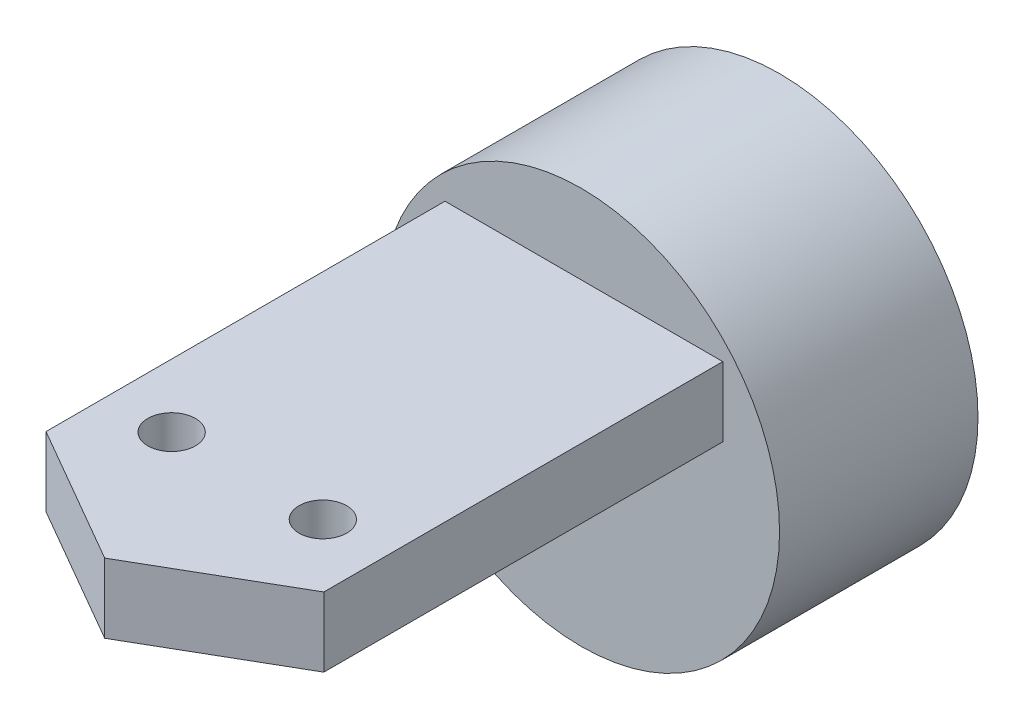
ISO-10303-21;
HEADER;
FILE_DESCRIPTION(('STEP AP214'),'2;1');
FILE_NAME('part.step','',(''),(''),'','','');
FILE_SCHEMA(('AUTOMOTIVE_DESIGN { 1 0 10303 214 1 1 1 1 }'));
ENDSEC;
DATA;
#1=APPLICATION_CONTEXT('core data for automotive mechanical design processes');
#2=APPLICATION_PROTOCOL_DEFINITION('international standard','automotive_design',2000,#1);
#3=PRODUCT_CONTEXT('',#1,'mechanical');
#4=PRODUCT('Part','Part','',(#3));
#5=PRODUCT_RELATED_PRODUCT_CATEGORY('part','',(#4));
#6=PRODUCT_DEFINITION_FORMATION('','',#4);
#7=PRODUCT_DEFINITION_CONTEXT('part definition',#1,'design');
#8=PRODUCT_DEFINITION('design','',#6,#7);
#9=PRODUCT_DEFINITION_SHAPE('','',#8);
#10=(LENGTH_UNIT() NAMED_UNIT(*) SI_UNIT(.MILLI.,.METRE.));
#11=(NAMED_UNIT(*) PLANE_ANGLE_UNIT() SI_UNIT($,.RADIAN.));
#12=(NAMED_UNIT(*) SI_UNIT($,.STERADIAN.) SOLID_ANGLE_UNIT());
#13=UNCERTAINTY_MEASURE_WITH_UNIT(LENGTH_MEASURE(1.E-05),#10,'distance_accuracy_value','');
#14=(GEOMETRIC_REPRESENTATION_CONTEXT(3) GLOBAL_UNCERTAINTY_ASSIGNED_CONTEXT((#13)) GLOBAL_UNIT_ASSIGNED_CONTEXT((#10,
#11,#12)) REPRESENTATION_CONTEXT('',''));
#15=CARTESIAN_POINT('',(0.,0.,0.));
#16=DIRECTION('',(0.,0.,1.));
#17=DIRECTION('',(1.,0.,0.));
#18=AXIS2_PLACEMENT_3D('',#15,#16,#17);
#19=CARTESIAN_POINT('',(0.,0.,10.));
#20=DIRECTION('',(0.,0.,1.));
#21=DIRECTION('',(1.,0.,0.));
#22=AXIS2_PLACEMENT_3D('',#19,#20,#21);
#23=PLANE('',#22);
#24=DIRECTION('',(0.,1.,0.));
#25=VECTOR('',#24,1.);
#26=CARTESIAN_POINT('',(7.1404429663646,-24.,10.));
#27=LINE('',#26,#25);
#28=CARTESIAN_POINT('',(7.1404429663646,2.5,10.));
#29=VERTEX_POINT('',#28);
#30=CARTESIAN_POINT('',(7.1404429663646,6.,10.));
#31=VERTEX_POINT('',#30);
#32=EDGE_CURVE('E99',#29,#31,#27,.T.);
#33=ORIENTED_EDGE('',*,*,#32,.F.);
#34=DIRECTION('',(1.,0.,0.));
#35=VECTOR('',#34,1.);
#36=CARTESIAN_POINT('',(0.,2.5,10.));
#37=LINE('',#36,#35);
#38=CARTESIAN_POINT('',(-6.85955703363552,2.5,10.));
#39=VERTEX_POINT('',#38);
#40=EDGE_CURVE('E129',#39,#29,#37,.T.);
#41=ORIENTED_EDGE('',*,*,#40,.F.);
#42=DIRECTION('',(0.,1.,0.));
#43=VECTOR('',#42,1.);
#44=CARTESIAN_POINT('',(-6.85955703363552,-24.,10.));
#45=LINE('',#44,#43);
#46=CARTESIAN_POINT('',(-6.85955703363552,6.,10.));
#47=VERTEX_POINT('',#46);
#48=EDGE_CURVE('E126',#39,#47,#45,.T.);
#49=ORIENTED_EDGE('',*,*,#48,.T.);
#50=DIRECTION('',(1.,0.,0.));
#51=VECTOR('',#50,1.);
#52=CARTESIAN_POINT('',(0.,6.,10.));
#53=LINE('',#52,#51);
#54=EDGE_CURVE('E119',#47,#31,#53,.T.);
#55=ORIENTED_EDGE('',*,*,#54,.T.);
#56=EDGE_LOOP('',(#33,#41,#49,#55));
#57=FACE_BOUND('',#56,.T.);
#58=CARTESIAN_POINT('',(0.,0.,10.));
#59=DIRECTION('',(0.,0.,1.));
#60=DIRECTION('',(1.,0.,0.));
#61=AXIS2_PLACEMENT_3D('',#58,#59,#60);
#62=CIRCLE('',#61,10.);
#63=CARTESIAN_POINT('',(10.,0.,10.));
#64=VERTEX_POINT('',#63);
#65=EDGE_CURVE('E163',#64,#64,#62,.T.);
#66=ORIENTED_EDGE('',*,*,#65,.T.);
#67=EDGE_LOOP('',(#66));
#68=FACE_BOUND('',#67,.T.);
#69=ADVANCED_FACE('F50',(#57,#68),#23,.T.);
#70=CARTESIAN_POINT('',(0.,2.5,40.));
#71=DIRECTION('',(0.,1.,0.));
#72=DIRECTION('',(0.,0.,1.));
#73=AXIS2_PLACEMENT_3D('',#70,#71,#72);
#74=PLANE('',#73);
#75=CARTESIAN_POINT('',(-3.66955703363546,2.5,26.9651136233699));
#76=DIRECTION('',(0.,1.,0.));
#77=DIRECTION('',(0.,0.,1.));
#78=AXIS2_PLACEMENT_3D('',#75,#76,#77);
#79=CIRCLE('',#78,1.2);
#80=CARTESIAN_POINT('',(-3.66955703363546,2.5,28.1651136233699));
#81=VERTEX_POINT('',#80);
#82=EDGE_CURVE('E167',#81,#81,#79,.T.);
#83=ORIENTED_EDGE('',*,*,#82,.T.);
#84=EDGE_LOOP('',(#83));
#85=FACE_BOUND('',#84,.T.);
#86=CARTESIAN_POINT('',(3.95044296636455,2.5,26.9651136233699));
#87=DIRECTION('',(0.,1.,0.));
#88=DIRECTION('',(0.,0.,-1.));
#89=AXIS2_PLACEMENT_3D('',#86,#87,#88);
#90=CIRCLE('',#89,1.2);
#91=CARTESIAN_POINT('',(3.95044296636455,2.5,25.7651136233699));
#92=VERTEX_POINT('',#91);
#93=EDGE_CURVE('E168',#92,#92,#90,.T.);
#94=ORIENTED_EDGE('',*,*,#93,.T.);
#95=EDGE_LOOP('',(#94));
#96=FACE_BOUND('',#95,.T.);
#97=DIRECTION('',(0.,0.,1.));
#98=VECTOR('',#97,1.);
#99=CARTESIAN_POINT('',(-6.85955703363552,2.5,40.));
#100=LINE('',#99,#98);
#101=CARTESIAN_POINT('',(-6.85955703363552,2.5,30.1061368430542));
#102=VERTEX_POINT('',#101);
#103=EDGE_CURVE('E75',#39,#102,#100,.T.);
#104=ORIENTED_EDGE('',*,*,#103,.F.);
#105=ORIENTED_EDGE('',*,*,#40,.T.);
#106=DIRECTION('',(0.,0.,1.));
#107=VECTOR('',#106,1.);
#108=CARTESIAN_POINT('',(7.1404429663646,2.5,40.));
#109=LINE('',#108,#107);
#110=CARTESIAN_POINT('',(7.1404429663646,2.5,30.1061368430542));
#111=VERTEX_POINT('',#110);
#112=EDGE_CURVE('E106',#29,#111,#109,.T.);
#113=ORIENTED_EDGE('',*,*,#112,.T.);
#114=DIRECTION('',(0.866025403784439,0.,-0.5));
#115=VECTOR('',#114,1.);
#116=CARTESIAN_POINT('',(-2.49905767614982,2.5,35.6715051338635));
#117=LINE('',#116,#115);
#118=CARTESIAN_POINT('',(0.140442966364545,2.5,34.1475887273816));
#119=VERTEX_POINT('',#118);
#120=EDGE_CURVE('E139',#119,#111,#117,.T.);
#121=ORIENTED_EDGE('',*,*,#120,.F.);
#122=DIRECTION('',(0.866025403784439,0.,0.5));
#123=VECTOR('',#122,1.);
#124=CARTESIAN_POINT('',(2.5692791593321,2.5,35.549877957209));
#125=LINE('',#124,#123);
#126=EDGE_CURVE('E67',#102,#119,#125,.T.);
#127=ORIENTED_EDGE('',*,*,#126,.F.);
#128=EDGE_LOOP('',(#104,#105,#113,#121,#127));
#129=FACE_BOUND('',#128,.T.);
#130=ADVANCED_FACE('F184',(#85,#96,#129),#74,.F.);
#131=CARTESIAN_POINT('',(0.,6.,40.));
#132=DIRECTION('',(0.,1.,0.));
#133=DIRECTION('',(0.,0.,1.));
#134=AXIS2_PLACEMENT_3D('',#131,#132,#133);
#135=PLANE('',#134);
#136=CARTESIAN_POINT('',(-3.66955703363546,6.,26.9651136233699));
#137=DIRECTION('',(0.,1.,0.));
#138=DIRECTION('',(0.,0.,1.));
#139=AXIS2_PLACEMENT_3D('',#136,#137,#138);
#140=CIRCLE('',#139,1.2);
#141=CARTESIAN_POINT('',(-3.66955703363546,6.,28.1651136233699));
#142=VERTEX_POINT('',#141);
#143=EDGE_CURVE('E176',#142,#142,#140,.T.);
#144=ORIENTED_EDGE('',*,*,#143,.F.);
#145=EDGE_LOOP('',(#144));
#146=FACE_BOUND('',#145,.T.);
#147=CARTESIAN_POINT('',(3.95044296636455,6.,26.9651136233699));
#148=DIRECTION('',(0.,1.,0.));
#149=DIRECTION('',(0.,0.,-1.));
#150=AXIS2_PLACEMENT_3D('',#147,#148,#149);
#151=CIRCLE('',#150,1.2);
#152=CARTESIAN_POINT('',(3.95044296636455,6.,25.7651136233699));
#153=VERTEX_POINT('',#152);
#154=EDGE_CURVE('E172',#153,#153,#151,.T.);
#155=ORIENTED_EDGE('',*,*,#154,.F.);
#156=EDGE_LOOP('',(#155));
#157=FACE_BOUND('',#156,.T.);
#158=ORIENTED_EDGE('',*,*,#54,.F.);
#159=DIRECTION('',(0.,0.,1.));
#160=VECTOR('',#159,1.);
#161=CARTESIAN_POINT('',(-6.85955703363552,6.,0.));
#162=LINE('',#161,#160);
#163=CARTESIAN_POINT('',(-6.85955703363552,6.,30.1061368430542));
#164=VERTEX_POINT('',#163);
#165=EDGE_CURVE('E113',#47,#164,#162,.T.);
#166=ORIENTED_EDGE('',*,*,#165,.T.);
#167=DIRECTION('',(0.866025403784439,0.,0.5));
#168=VECTOR('',#167,1.);
#169=CARTESIAN_POINT('',(-14.7512289163567,6.,25.549877957209));
#170=LINE('',#169,#168);
#171=CARTESIAN_POINT('',(0.140442966364545,6.,34.1475887273816));
#172=VERTEX_POINT('',#171);
#173=EDGE_CURVE('E158',#164,#172,#170,.T.);
#174=ORIENTED_EDGE('',*,*,#173,.T.);
#175=DIRECTION('',(0.866025403784439,0.,-0.5));
#176=VECTOR('',#175,1.);
#177=CARTESIAN_POINT('',(14.8214503995389,6.,25.6715051338635));
#178=LINE('',#177,#176);
#179=CARTESIAN_POINT('',(7.1404429663646,6.,30.1061368430542));
#180=VERTEX_POINT('',#179);
#181=EDGE_CURVE('E122',#172,#180,#178,.T.);
#182=ORIENTED_EDGE('',*,*,#181,.T.);
#183=DIRECTION('',(0.,0.,1.));
#184=VECTOR('',#183,1.);
#185=CARTESIAN_POINT('',(7.1404429663646,6.,0.));
#186=LINE('',#185,#184);
#187=EDGE_CURVE('E103',#31,#180,#186,.T.);
#188=ORIENTED_EDGE('',*,*,#187,.F.);
#189=EDGE_LOOP('',(#158,#166,#174,#182,#188));
#190=FACE_BOUND('',#189,.T.);
#191=ADVANCED_FACE('F117',(#146,#157,#190),#135,.T.);
#192=CARTESIAN_POINT('',(-14.7512289163567,-24.,25.549877957209));
#193=DIRECTION('',(-0.5,0.,0.866025403784439));
#194=DIRECTION('',(0.866025403784439,0.,0.5));
#195=AXIS2_PLACEMENT_3D('',#192,#193,#194);
#196=PLANE('',#195);
#197=ORIENTED_EDGE('',*,*,#126,.T.);
#198=DIRECTION('',(0.,1.,0.));
#199=VECTOR('',#198,1.);
#200=CARTESIAN_POINT('',(0.140442966364545,-24.,34.1475887273816));
#201=LINE('',#200,#199);
#202=EDGE_CURVE('E148',#119,#172,#201,.T.);
#203=ORIENTED_EDGE('',*,*,#202,.T.);
#204=ORIENTED_EDGE('',*,*,#173,.F.);
#205=DIRECTION('',(0.,1.,0.));
#206=VECTOR('',#205,1.);
#207=CARTESIAN_POINT('',(-6.85955703363552,-24.,30.1061368430542));
#208=LINE('',#207,#206);
#209=EDGE_CURVE('E151',#102,#164,#208,.T.);
#210=ORIENTED_EDGE('',*,*,#209,.F.);
#211=EDGE_LOOP('',(#197,#203,#204,#210));
#212=FACE_BOUND('',#211,.T.);
#213=ADVANCED_FACE('F196',(#212),#196,.T.);
#214=CARTESIAN_POINT('',(14.8214503995389,-24.,25.6715051338635));
#215=DIRECTION('',(0.5,0.,0.866025403784439));
#216=DIRECTION('',(0.866025403784439,0.,-0.5));
#217=AXIS2_PLACEMENT_3D('',#214,#215,#216);
#218=PLANE('',#217);
#219=ORIENTED_EDGE('',*,*,#120,.T.);
#220=DIRECTION('',(0.,1.,0.));
#221=VECTOR('',#220,1.);
#222=CARTESIAN_POINT('',(7.1404429663646,-24.,30.1061368430542));
#223=LINE('',#222,#221);
#224=EDGE_CURVE('E112',#111,#180,#223,.T.);
#225=ORIENTED_EDGE('',*,*,#224,.T.);
#226=ORIENTED_EDGE('',*,*,#181,.F.);
#227=ORIENTED_EDGE('',*,*,#202,.F.);
#228=EDGE_LOOP('',(#219,#225,#226,#227));
#229=FACE_BOUND('',#228,.T.);
#230=ADVANCED_FACE('F227',(#229),#218,.T.);
#231=CARTESIAN_POINT('',(-6.85955703363552,-24.,0.));
#232=DIRECTION('',(-1.,0.,0.));
#233=DIRECTION('',(0.,0.,1.));
#234=AXIS2_PLACEMENT_3D('',#231,#232,#233);
#235=PLANE('',#234);
#236=ORIENTED_EDGE('',*,*,#103,.T.);
#237=ORIENTED_EDGE('',*,*,#209,.T.);
#238=ORIENTED_EDGE('',*,*,#165,.F.);
#239=ORIENTED_EDGE('',*,*,#48,.F.);
#240=EDGE_LOOP('',(#236,#237,#238,#239));
#241=FACE_BOUND('',#240,.T.);
#242=ADVANCED_FACE('F226',(#241),#235,.T.);
#243=CARTESIAN_POINT('',(7.1404429663646,-24.,0.));
#244=DIRECTION('',(-1.,0.,0.));
#245=DIRECTION('',(0.,0.,1.));
#246=AXIS2_PLACEMENT_3D('',#243,#244,#245);
#247=PLANE('',#246);
#248=ORIENTED_EDGE('',*,*,#32,.T.);
#249=ORIENTED_EDGE('',*,*,#187,.T.);
#250=ORIENTED_EDGE('',*,*,#224,.F.);
#251=ORIENTED_EDGE('',*,*,#112,.F.);
#252=EDGE_LOOP('',(#248,#249,#250,#251));
#253=FACE_BOUND('',#252,.T.);
#254=ADVANCED_FACE('F101',(#253),#247,.F.);
#255=CARTESIAN_POINT('',(0.,0.,-20.));
#256=DIRECTION('',(0.,0.,1.));
#257=DIRECTION('',(1.,0.,0.));
#258=AXIS2_PLACEMENT_3D('',#255,#256,#257);
#259=CYLINDRICAL_SURFACE('',#258,10.);
#260=ORIENTED_EDGE('',*,*,#65,.F.);
#261=EDGE_LOOP('',(#260));
#262=FACE_BOUND('',#261,.T.);
#263=CARTESIAN_POINT('',(0.,0.,0.));
#264=DIRECTION('',(0.,0.,1.));
#265=DIRECTION('',(1.,0.,0.));
#266=AXIS2_PLACEMENT_3D('',#263,#264,#265);
#267=CIRCLE('',#266,10.);
#268=CARTESIAN_POINT('',(10.,0.,0.));
#269=VERTEX_POINT('',#268);
#270=EDGE_CURVE('E54',#269,#269,#267,.T.);
#271=ORIENTED_EDGE('',*,*,#270,.T.);
#272=EDGE_LOOP('',(#271));
#273=FACE_BOUND('',#272,.T.);
#274=ADVANCED_FACE('F221',(#262,#273),#259,.T.);
#275=CARTESIAN_POINT('',(0.,0.,-5.));
#276=DIRECTION('',(0.,0.,-1.));
#277=DIRECTION('',(-1.,0.,0.));
#278=AXIS2_PLACEMENT_3D('',#275,#276,#277);
#279=PLANE('',#278);
#280=CARTESIAN_POINT('',(0.,0.,-5.));
#281=DIRECTION('',(0.,0.,-1.));
#282=DIRECTION('',(-1.,0.,0.));
#283=AXIS2_PLACEMENT_3D('',#280,#281,#282);
#284=CIRCLE('',#283,2.5);
#285=CARTESIAN_POINT('',(-2.5,0.,-5.));
#286=VERTEX_POINT('',#285);
#287=EDGE_CURVE('E60',#286,#286,#284,.T.);
#288=ORIENTED_EDGE('',*,*,#287,.T.);
#289=EDGE_LOOP('',(#288));
#290=FACE_BOUND('',#289,.T.);
#291=ADVANCED_FACE('F218',(#290),#279,.T.);
#292=CARTESIAN_POINT('',(0.,0.,-5.));
#293=DIRECTION('',(0.,0.,1.));
#294=DIRECTION('',(1.,0.,0.));
#295=AXIS2_PLACEMENT_3D('',#292,#293,#294);
#296=CYLINDRICAL_SURFACE('',#295,2.5);
#297=ORIENTED_EDGE('',*,*,#287,.F.);
#298=EDGE_LOOP('',(#297));
#299=FACE_BOUND('',#298,.T.);
#300=CARTESIAN_POINT('',(0.,0.,0.));
#301=DIRECTION('',(0.,0.,-1.));
#302=DIRECTION('',(-1.,0.,0.));
#303=AXIS2_PLACEMENT_3D('',#300,#301,#302);
#304=CIRCLE('',#303,2.5);
#305=CARTESIAN_POINT('',(-2.5,0.,0.));
#306=VERTEX_POINT('',#305);
#307=EDGE_CURVE('E13',#306,#306,#304,.T.);
#308=ORIENTED_EDGE('',*,*,#307,.T.);
#309=EDGE_LOOP('',(#308));
#310=FACE_BOUND('',#309,.T.);
#311=ADVANCED_FACE('F206',(#299,#310),#296,.T.);
#312=CARTESIAN_POINT('',(0.,0.,0.));
#313=DIRECTION('',(0.,0.,1.));
#314=DIRECTION('',(1.,0.,0.));
#315=AXIS2_PLACEMENT_3D('',#312,#313,#314);
#316=PLANE('',#315);
#317=ORIENTED_EDGE('',*,*,#307,.F.);
#318=EDGE_LOOP('',(#317));
#319=FACE_BOUND('',#318,.T.);
#320=ORIENTED_EDGE('',*,*,#270,.F.);
#321=EDGE_LOOP('',(#320));
#322=FACE_BOUND('',#321,.T.);
#323=ADVANCED_FACE('F52',(#319,#322),#316,.F.);
#324=CARTESIAN_POINT('',(3.95044296636455,2.5,26.9651136233699));
#325=DIRECTION('',(0.,1.,0.));
#326=DIRECTION('',(0.,0.,1.));
#327=AXIS2_PLACEMENT_3D('',#324,#325,#326);
#328=CYLINDRICAL_SURFACE('',#327,1.2);
#329=ORIENTED_EDGE('',*,*,#93,.F.);
#330=EDGE_LOOP('',(#329));
#331=FACE_BOUND('',#330,.T.);
#332=ORIENTED_EDGE('',*,*,#154,.T.);
#333=EDGE_LOOP('',(#332));
#334=FACE_BOUND('',#333,.T.);
#335=ADVANCED_FACE('F190',(#331,#334),#328,.F.);
#336=CARTESIAN_POINT('',(-3.66955703363546,2.5,26.9651136233699));
#337=DIRECTION('',(0.,1.,0.));
#338=DIRECTION('',(0.,0.,1.));
#339=AXIS2_PLACEMENT_3D('',#336,#337,#338);
#340=CYLINDRICAL_SURFACE('',#339,1.2);
#341=ORIENTED_EDGE('',*,*,#82,.F.);
#342=EDGE_LOOP('',(#341));
#343=FACE_BOUND('',#342,.T.);
#344=ORIENTED_EDGE('',*,*,#143,.T.);
#345=EDGE_LOOP('',(#344));
#346=FACE_BOUND('',#345,.T.);
#347=ADVANCED_FACE('F187',(#343,#346),#340,.F.);
#348=CLOSED_SHELL('',(#69,#130,#191,#213,#230,#242,#254,#274,#291,#311,#323,#335,#347));
#349=MANIFOLD_SOLID_BREP('B2',#348);
#350=ADVANCED_BREP_SHAPE_REPRESENTATION('',(#18,#349),#14);
#351=SHAPE_DEFINITION_REPRESENTATION(#9,#350);
ENDSEC;
END-ISO-10303-21;
